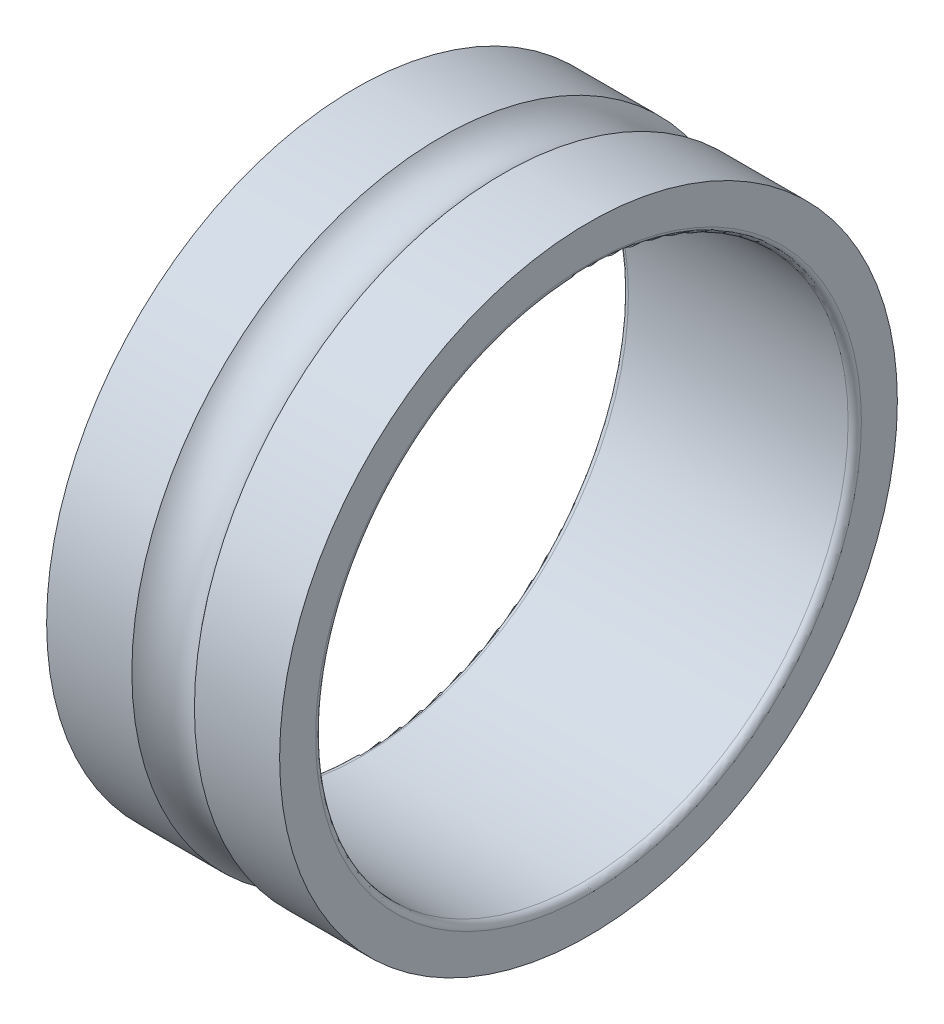
ISO-10303-21;
HEADER;
FILE_DESCRIPTION(('STEP AP214'),'2;1');
FILE_NAME('part.step','',(''),(''),'','','');
FILE_SCHEMA(('AUTOMOTIVE_DESIGN { 1 0 10303 214 1 1 1 1 }'));
ENDSEC;
DATA;
#1=APPLICATION_CONTEXT('core data for automotive mechanical design processes');
#2=APPLICATION_PROTOCOL_DEFINITION('international standard','automotive_design',2000,#1);
#3=PRODUCT_CONTEXT('',#1,'mechanical');
#4=PRODUCT('Part','Part','',(#3));
#5=PRODUCT_RELATED_PRODUCT_CATEGORY('part','',(#4));
#6=PRODUCT_DEFINITION_FORMATION('','',#4);
#7=PRODUCT_DEFINITION_CONTEXT('part definition',#1,'design');
#8=PRODUCT_DEFINITION('design','',#6,#7);
#9=PRODUCT_DEFINITION_SHAPE('','',#8);
#10=(LENGTH_UNIT() NAMED_UNIT(*) SI_UNIT(.MILLI.,.METRE.));
#11=(NAMED_UNIT(*) PLANE_ANGLE_UNIT() SI_UNIT($,.RADIAN.));
#12=(NAMED_UNIT(*) SI_UNIT($,.STERADIAN.) SOLID_ANGLE_UNIT());
#13=UNCERTAINTY_MEASURE_WITH_UNIT(LENGTH_MEASURE(1.E-05),#10,'distance_accuracy_value','');
#14=(GEOMETRIC_REPRESENTATION_CONTEXT(3) GLOBAL_UNCERTAINTY_ASSIGNED_CONTEXT((#13)) GLOBAL_UNIT_ASSIGNED_CONTEXT((#10,
#11,#12)) REPRESENTATION_CONTEXT('',''));
#15=CARTESIAN_POINT('',(0.,0.,0.));
#16=DIRECTION('',(0.,0.,1.));
#17=DIRECTION('',(1.,0.,0.));
#18=AXIS2_PLACEMENT_3D('',#15,#16,#17);
#19=CARTESIAN_POINT('',(0.,4.64,0.));
#20=DIRECTION('',(-1.,0.,0.));
#21=DIRECTION('',(0.,0.,1.));
#22=AXIS2_PLACEMENT_3D('',#19,#20,#21);
#23=PLANE('',#22);
#24=CARTESIAN_POINT('',(0.,0.,0.));
#25=DIRECTION('',(1.,0.,0.));
#26=DIRECTION('',(0.,0.,-1.));
#27=AXIS2_PLACEMENT_3D('',#24,#25,#26);
#28=CIRCLE('',#27,4.09999999999993);
#29=CARTESIAN_POINT('',(0.,0.,-4.09999999999993));
#30=VERTEX_POINT('',#29);
#31=EDGE_CURVE('E43',#30,#30,#28,.T.);
#32=ORIENTED_EDGE('',*,*,#31,.T.);
#33=EDGE_LOOP('',(#32));
#34=FACE_BOUND('',#33,.T.);
#35=CARTESIAN_POINT('',(0.,0.,0.));
#36=DIRECTION('',(1.,0.,0.));
#37=DIRECTION('',(0.,0.,-1.));
#38=AXIS2_PLACEMENT_3D('',#35,#36,#37);
#39=CIRCLE('',#38,4.64);
#40=CARTESIAN_POINT('',(0.,0.,-4.64));
#41=VERTEX_POINT('',#40);
#42=EDGE_CURVE('E40',#41,#41,#39,.T.);
#43=ORIENTED_EDGE('',*,*,#42,.F.);
#44=EDGE_LOOP('',(#43));
#45=FACE_BOUND('',#44,.T.);
#46=ADVANCED_FACE('F14',(#34,#45),#23,.T.);
#47=CARTESIAN_POINT('',(0.0999999999999217,0.,0.));
#48=DIRECTION('',(1.,0.,0.));
#49=DIRECTION('',(0.,0.,-1.));
#50=AXIS2_PLACEMENT_3D('',#47,#48,#49);
#51=TOROIDAL_SURFACE('',#50,4.09999999999993,0.0999999999999217);
#52=CARTESIAN_POINT('',(0.1,0.,0.));
#53=DIRECTION('',(1.,0.,0.));
#54=DIRECTION('',(0.,0.,-1.));
#55=AXIS2_PLACEMENT_3D('',#52,#53,#54);
#56=CIRCLE('',#55,4.);
#57=CARTESIAN_POINT('',(0.1,0.,-4.));
#58=VERTEX_POINT('',#57);
#59=EDGE_CURVE('E37',#58,#58,#56,.T.);
#60=ORIENTED_EDGE('',*,*,#59,.T.);
#61=EDGE_LOOP('',(#60));
#62=FACE_BOUND('',#61,.T.);
#63=ORIENTED_EDGE('',*,*,#31,.F.);
#64=EDGE_LOOP('',(#63));
#65=FACE_BOUND('',#64,.T.);
#66=ADVANCED_FACE('F49',(#62,#65),#51,.T.);
#67=CARTESIAN_POINT('',(3.5,0.,0.));
#68=DIRECTION('',(1.,0.,0.));
#69=DIRECTION('',(0.,0.,-1.));
#70=AXIS2_PLACEMENT_3D('',#67,#68,#69);
#71=CYLINDRICAL_SURFACE('',#70,4.64);
#72=ORIENTED_EDGE('',*,*,#42,.T.);
#73=EDGE_LOOP('',(#72));
#74=FACE_BOUND('',#73,.T.);
#75=CARTESIAN_POINT('',(1.2800382994328,0.,0.));
#76=DIRECTION('',(1.,0.,0.));
#77=DIRECTION('',(0.,0.,-1.));
#78=AXIS2_PLACEMENT_3D('',#75,#76,#77);
#79=CIRCLE('',#78,4.64);
#80=CARTESIAN_POINT('',(1.2800382994328,0.,-4.64));
#81=VERTEX_POINT('',#80);
#82=EDGE_CURVE('E34',#81,#81,#79,.T.);
#83=ORIENTED_EDGE('',*,*,#82,.F.);
#84=EDGE_LOOP('',(#83));
#85=FACE_BOUND('',#84,.T.);
#86=ADVANCED_FACE('F51',(#74,#85),#71,.T.);
#87=CARTESIAN_POINT('',(3.5,0.,0.));
#88=DIRECTION('',(1.,0.,0.));
#89=DIRECTION('',(0.,0.,-1.));
#90=AXIS2_PLACEMENT_3D('',#87,#88,#89);
#91=CYLINDRICAL_SURFACE('',#90,4.);
#92=CARTESIAN_POINT('',(3.4,0.,0.));
#93=DIRECTION('',(1.,0.,0.));
#94=DIRECTION('',(0.,0.,-1.));
#95=AXIS2_PLACEMENT_3D('',#92,#93,#94);
#96=CIRCLE('',#95,4.);
#97=CARTESIAN_POINT('',(3.4,0.,-4.));
#98=VERTEX_POINT('',#97);
#99=EDGE_CURVE('E29',#98,#98,#96,.T.);
#100=ORIENTED_EDGE('',*,*,#99,.T.);
#101=EDGE_LOOP('',(#100));
#102=FACE_BOUND('',#101,.T.);
#103=ORIENTED_EDGE('',*,*,#59,.F.);
#104=EDGE_LOOP('',(#103));
#105=FACE_BOUND('',#104,.T.);
#106=ADVANCED_FACE('F59',(#102,#105),#91,.F.);
#107=CARTESIAN_POINT('',(1.75,0.,0.));
#108=DIRECTION('',(1.,0.,0.));
#109=DIRECTION('',(0.,0.,-1.));
#110=AXIS2_PLACEMENT_3D('',#107,#108,#109);
#111=TOROIDAL_SURFACE('',#110,5.,0.592000000000032);
#112=CARTESIAN_POINT('',(2.2199617005672,0.,0.));
#113=DIRECTION('',(1.,0.,0.));
#114=DIRECTION('',(0.,0.,-1.));
#115=AXIS2_PLACEMENT_3D('',#112,#113,#114);
#116=CIRCLE('',#115,4.64);
#117=CARTESIAN_POINT('',(2.2199617005672,0.,-4.64));
#118=VERTEX_POINT('',#117);
#119=EDGE_CURVE('E25',#118,#118,#116,.T.);
#120=ORIENTED_EDGE('',*,*,#119,.F.);
#121=EDGE_LOOP('',(#120));
#122=FACE_BOUND('',#121,.T.);
#123=ORIENTED_EDGE('',*,*,#82,.T.);
#124=EDGE_LOOP('',(#123));
#125=FACE_BOUND('',#124,.T.);
#126=ADVANCED_FACE('F66',(#122,#125),#111,.F.);
#127=CARTESIAN_POINT('',(3.40000000000015,0.,0.));
#128=DIRECTION('',(1.,0.,0.));
#129=DIRECTION('',(0.,0.,-1.));
#130=AXIS2_PLACEMENT_3D('',#127,#128,#129);
#131=TOROIDAL_SURFACE('',#130,4.09999999999985,0.099999999999845);
#132=CARTESIAN_POINT('',(3.5,0.,0.));
#133=DIRECTION('',(1.,0.,0.));
#134=DIRECTION('',(0.,0.,-1.));
#135=AXIS2_PLACEMENT_3D('',#132,#133,#134);
#136=CIRCLE('',#135,4.09999999999985);
#137=CARTESIAN_POINT('',(3.5,0.,-4.09999999999985));
#138=VERTEX_POINT('',#137);
#139=EDGE_CURVE('E21',#138,#138,#136,.T.);
#140=ORIENTED_EDGE('',*,*,#139,.T.);
#141=EDGE_LOOP('',(#140));
#142=FACE_BOUND('',#141,.T.);
#143=ORIENTED_EDGE('',*,*,#99,.F.);
#144=EDGE_LOOP('',(#143));
#145=FACE_BOUND('',#144,.T.);
#146=ADVANCED_FACE('F70',(#142,#145),#131,.T.);
#147=CARTESIAN_POINT('',(3.5,0.,0.));
#148=DIRECTION('',(1.,0.,0.));
#149=DIRECTION('',(0.,0.,-1.));
#150=AXIS2_PLACEMENT_3D('',#147,#148,#149);
#151=CYLINDRICAL_SURFACE('',#150,4.64);
#152=ORIENTED_EDGE('',*,*,#119,.T.);
#153=EDGE_LOOP('',(#152));
#154=FACE_BOUND('',#153,.T.);
#155=CARTESIAN_POINT('',(3.5,0.,0.));
#156=DIRECTION('',(1.,0.,0.));
#157=DIRECTION('',(0.,0.,-1.));
#158=AXIS2_PLACEMENT_3D('',#155,#156,#157);
#159=CIRCLE('',#158,4.64);
#160=CARTESIAN_POINT('',(3.5,0.,-4.64));
#161=VERTEX_POINT('',#160);
#162=EDGE_CURVE('E10',#161,#161,#159,.T.);
#163=ORIENTED_EDGE('',*,*,#162,.F.);
#164=EDGE_LOOP('',(#163));
#165=FACE_BOUND('',#164,.T.);
#166=ADVANCED_FACE('F73',(#154,#165),#151,.T.);
#167=CARTESIAN_POINT('',(3.5,4.1,0.));
#168=DIRECTION('',(1.,0.,0.));
#169=DIRECTION('',(0.,0.,-1.));
#170=AXIS2_PLACEMENT_3D('',#167,#168,#169);
#171=PLANE('',#170);
#172=ORIENTED_EDGE('',*,*,#162,.T.);
#173=EDGE_LOOP('',(#172));
#174=FACE_BOUND('',#173,.T.);
#175=ORIENTED_EDGE('',*,*,#139,.F.);
#176=EDGE_LOOP('',(#175));
#177=FACE_BOUND('',#176,.T.);
#178=ADVANCED_FACE('F16',(#174,#177),#171,.T.);
#179=CLOSED_SHELL('',(#46,#66,#86,#106,#126,#146,#166,#178));
#180=MANIFOLD_SOLID_BREP('B1',#179);
#181=ADVANCED_BREP_SHAPE_REPRESENTATION('',(#18,#180),#14);
#182=SHAPE_DEFINITION_REPRESENTATION(#9,#181);
ENDSEC;
END-ISO-10303-21;
